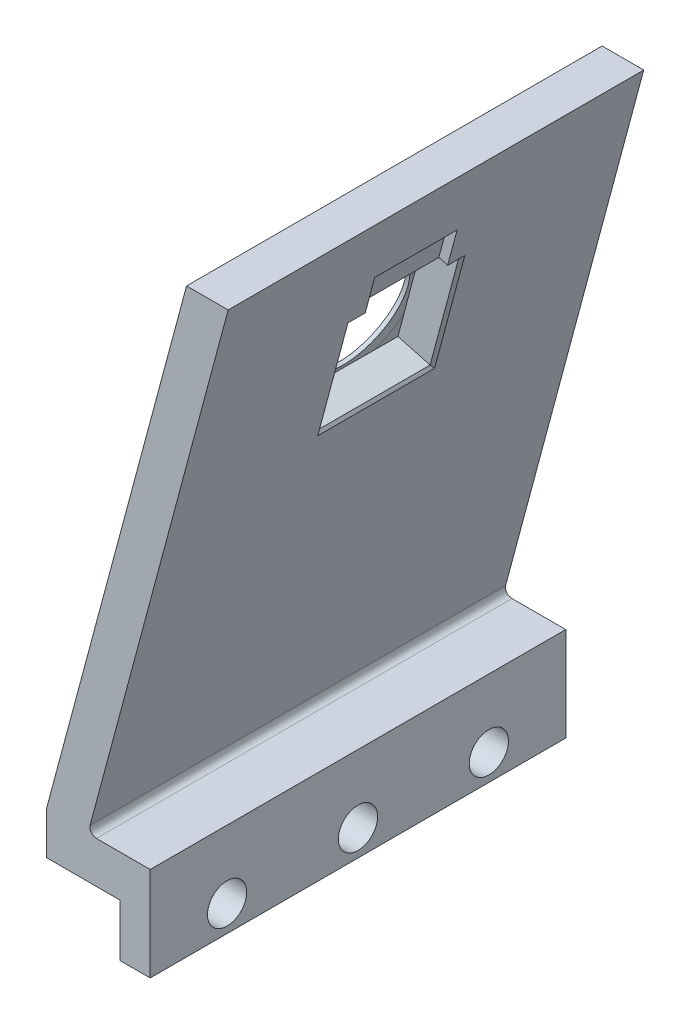
ISO-10303-21;
HEADER;
FILE_DESCRIPTION(('STEP AP214'),'2;1');
FILE_NAME('part.step','',(''),(''),'','','');
FILE_SCHEMA(('AUTOMOTIVE_DESIGN { 1 0 10303 214 1 1 1 1 }'));
ENDSEC;
DATA;
#1=APPLICATION_CONTEXT('core data for automotive mechanical design processes');
#2=APPLICATION_PROTOCOL_DEFINITION('international standard','automotive_design',2000,#1);
#3=PRODUCT_CONTEXT('',#1,'mechanical');
#4=PRODUCT('Part','Part','',(#3));
#5=PRODUCT_RELATED_PRODUCT_CATEGORY('part','',(#4));
#6=PRODUCT_DEFINITION_FORMATION('','',#4);
#7=PRODUCT_DEFINITION_CONTEXT('part definition',#1,'design');
#8=PRODUCT_DEFINITION('design','',#6,#7);
#9=PRODUCT_DEFINITION_SHAPE('','',#8);
#10=(LENGTH_UNIT() NAMED_UNIT(*) SI_UNIT(.MILLI.,.METRE.));
#11=(NAMED_UNIT(*) PLANE_ANGLE_UNIT() SI_UNIT($,.RADIAN.));
#12=(NAMED_UNIT(*) SI_UNIT($,.STERADIAN.) SOLID_ANGLE_UNIT());
#13=UNCERTAINTY_MEASURE_WITH_UNIT(LENGTH_MEASURE(1.E-05),#10,'distance_accuracy_value','');
#14=(GEOMETRIC_REPRESENTATION_CONTEXT(3) GLOBAL_UNCERTAINTY_ASSIGNED_CONTEXT((#13)) GLOBAL_UNIT_ASSIGNED_CONTEXT((#10,
#11,#12)) REPRESENTATION_CONTEXT('',''));
#15=CARTESIAN_POINT('',(0.,0.,0.));
#16=DIRECTION('',(0.,0.,1.));
#17=DIRECTION('',(1.,0.,0.));
#18=AXIS2_PLACEMENT_3D('',#15,#16,#17);
#19=CARTESIAN_POINT('',(0.310684369722334,-0.0832476259680732,0.));
#20=DIRECTION('',(0.965925826289067,-0.258819045102524,0.));
#21=DIRECTION('',(0.258819045102524,0.965925826289067,0.));
#22=AXIS2_PLACEMENT_3D('',#19,#20,#21);
#23=PLANE('',#22);
#24=DIRECTION('',(0.258819045102524,0.965925826289067,0.));
#25=VECTOR('',#24,1.);
#26=CARTESIAN_POINT('',(9.20190655999273,33.0992453295044,11.88));
#27=LINE('',#26,#25);
#28=CARTESIAN_POINT('',(6.99418010526819,24.8598980312586,11.88));
#29=VERTEX_POINT('',#28);
#30=CARTESIAN_POINT('',(7.46511628429863,26.6174557785225,11.88));
#31=VERTEX_POINT('',#30);
#32=EDGE_CURVE('E306',#29,#31,#27,.T.);
#33=ORIENTED_EDGE('',*,*,#32,.T.);
#34=CARTESIAN_POINT('',(8.08949677956881,28.9476755101258,16.145));
#35=DIRECTION('',(0.965925826289067,-0.258819045102524,0.));
#36=DIRECTION('',(0.258819045102524,0.965925826289067,0.));
#37=AXIS2_PLACEMENT_3D('',#34,#35,#36);
#38=CIRCLE('',#37,4.90000000004359);
#39=CARTESIAN_POINT('',(6.9941801052682,24.8598980312586,13.6751099889485));
#40=VERTEX_POINT('',#39);
#41=EDGE_CURVE('E438',#31,#40,#38,.F.);
#42=ORIENTED_EDGE('',*,*,#41,.T.);
#43=DIRECTION('',(0.,0.,-1.));
#44=VECTOR('',#43,1.);
#45=CARTESIAN_POINT('',(6.99418010526819,24.8598980312586,20.41));
#46=LINE('',#45,#44);
#47=EDGE_CURVE('E299',#40,#29,#46,.T.);
#48=ORIENTED_EDGE('',*,*,#47,.T.);
#49=EDGE_LOOP('',(#33,#42,#48));
#50=FACE_BOUND('',#49,.T.);
#51=ADVANCED_FACE('F80',(#50),#23,.T.);
#52=CARTESIAN_POINT('',(6.99418010526819,24.8598980312586,20.41));
#53=VERTEX_POINT('',#52);
#54=CARTESIAN_POINT('',(6.9941801052682,24.8598980312586,18.6148900110515));
#55=VERTEX_POINT('',#54);
#56=EDGE_CURVE('E301',#53,#55,#46,.T.);
#57=ORIENTED_EDGE('',*,*,#56,.T.);
#58=CARTESIAN_POINT('',(8.08949677956881,28.9476755101258,16.145));
#59=DIRECTION('',(0.965925826289067,-0.258819045102524,0.));
#60=DIRECTION('',(0.258819045102524,0.965925826289067,0.));
#61=AXIS2_PLACEMENT_3D('',#58,#59,#60);
#62=CIRCLE('',#61,4.90000000004359);
#63=CARTESIAN_POINT('',(7.46511628429863,26.6174557785225,20.41));
#64=VERTEX_POINT('',#63);
#65=EDGE_CURVE('E435',#55,#64,#62,.F.);
#66=ORIENTED_EDGE('',*,*,#65,.T.);
#67=DIRECTION('',(-0.258819045102524,-0.965925826289067,0.));
#68=VECTOR('',#67,1.);
#69=CARTESIAN_POINT('',(9.20190655999273,33.0992453295044,20.41));
#70=LINE('',#69,#68);
#71=EDGE_CURVE('E300',#64,#53,#70,.T.);
#72=ORIENTED_EDGE('',*,*,#71,.T.);
#73=EDGE_LOOP('',(#57,#66,#72));
#74=FACE_BOUND('',#73,.T.);
#75=ADVANCED_FACE('F512',(#74),#23,.T.);
#76=CARTESIAN_POINT('',(9.20190655999273,33.0992453295044,20.41));
#77=VERTEX_POINT('',#76);
#78=CARTESIAN_POINT('',(8.713877274839,31.2778952417292,20.41));
#79=VERTEX_POINT('',#78);
#80=EDGE_CURVE('E295',#77,#79,#70,.T.);
#81=ORIENTED_EDGE('',*,*,#80,.T.);
#82=CARTESIAN_POINT('',(8.08949677956881,28.9476755101258,16.145));
#83=DIRECTION('',(0.965925826289067,-0.258819045102524,0.));
#84=DIRECTION('',(0.258819045102524,0.965925826289067,0.));
#85=AXIS2_PLACEMENT_3D('',#82,#83,#84);
#86=CIRCLE('',#85,4.90000000004359);
#87=CARTESIAN_POINT('',(9.20190655999273,33.0992453295044,18.498085743374));
#88=VERTEX_POINT('',#87);
#89=EDGE_CURVE('E432',#79,#88,#86,.F.);
#90=ORIENTED_EDGE('',*,*,#89,.T.);
#91=DIRECTION('',(0.,0.,1.));
#92=VECTOR('',#91,1.);
#93=CARTESIAN_POINT('',(9.20190655999273,33.0992453295044,20.41));
#94=LINE('',#93,#92);
#95=EDGE_CURVE('E310',#88,#77,#94,.T.);
#96=ORIENTED_EDGE('',*,*,#95,.T.);
#97=EDGE_LOOP('',(#81,#90,#96));
#98=FACE_BOUND('',#97,.T.);
#99=ADVANCED_FACE('F517',(#98),#23,.T.);
#100=CARTESIAN_POINT('',(0.,-3.18,31.75));
#101=DIRECTION('',(0.,1.,0.));
#102=DIRECTION('',(-1.,0.,0.));
#103=AXIS2_PLACEMENT_3D('',#100,#101,#102);
#104=PLANE('',#103);
#105=DIRECTION('',(0.,0.,-1.));
#106=VECTOR('',#105,1.);
#107=CARTESIAN_POINT('',(5.64337203172193,-3.18,31.75));
#108=LINE('',#107,#106);
#109=CARTESIAN_POINT('',(5.64337203172193,-3.18,31.75));
#110=VERTEX_POINT('',#109);
#111=CARTESIAN_POINT('',(5.64337203172193,-3.18,0.));
#112=VERTEX_POINT('',#111);
#113=EDGE_CURVE('E399',#110,#112,#108,.T.);
#114=ORIENTED_EDGE('',*,*,#113,.F.);
#115=DIRECTION('',(1.,0.,0.));
#116=VECTOR('',#115,1.);
#117=CARTESIAN_POINT('',(0.,-3.18,31.75));
#118=LINE('',#117,#116);
#119=CARTESIAN_POINT('',(0.,-3.18,31.75));
#120=VERTEX_POINT('',#119);
#121=EDGE_CURVE('E340',#120,#110,#118,.T.);
#122=ORIENTED_EDGE('',*,*,#121,.F.);
#123=DIRECTION('',(0.,0.,-1.));
#124=VECTOR('',#123,1.);
#125=CARTESIAN_POINT('',(0.,-3.18,31.75));
#126=LINE('',#125,#124);
#127=CARTESIAN_POINT('',(0.,-3.18,0.));
#128=VERTEX_POINT('',#127);
#129=EDGE_CURVE('E392',#120,#128,#126,.T.);
#130=ORIENTED_EDGE('',*,*,#129,.T.);
#131=DIRECTION('',(1.,0.,0.));
#132=VECTOR('',#131,1.);
#133=CARTESIAN_POINT('',(0.,-3.18,0.));
#134=LINE('',#133,#132);
#135=EDGE_CURVE('E367',#128,#112,#134,.T.);
#136=ORIENTED_EDGE('',*,*,#135,.T.);
#137=EDGE_LOOP('',(#114,#122,#130,#136));
#138=FACE_BOUND('',#137,.T.);
#139=ADVANCED_FACE('F526',(#138),#104,.F.);
#140=CARTESIAN_POINT('',(0.,0.,31.75));
#141=DIRECTION('',(-0.965925826289067,0.258819045102525,0.));
#142=DIRECTION('',(-0.258819045102525,-0.965925826289067,0.));
#143=AXIS2_PLACEMENT_3D('',#140,#141,#142);
#144=PLANE('',#143);
#145=CARTESIAN_POINT('',(7.77881240984649,29.0309231360939,16.145));
#146=DIRECTION('',(-0.965925826289067,0.258819045102525,0.));
#147=DIRECTION('',(-0.258819045102525,-0.965925826289067,0.));
#148=AXIS2_PLACEMENT_3D('',#145,#146,#147);
#149=CIRCLE('',#148,3.98);
#150=CARTESIAN_POINT('',(6.74871261033844,25.1865383474634,16.145));
#151=VERTEX_POINT('',#150);
#152=EDGE_CURVE('E293',#151,#151,#149,.T.);
#153=ORIENTED_EDGE('',*,*,#152,.F.);
#154=EDGE_LOOP('',(#153));
#155=FACE_BOUND('',#154,.T.);
#156=DIRECTION('',(0.258819045102525,0.965925826289067,0.));
#157=VECTOR('',#156,1.);
#158=CARTESIAN_POINT('',(0.,0.,0.));
#159=LINE('',#158,#157);
#160=CARTESIAN_POINT('',(0.,0.,0.));
#161=VERTEX_POINT('',#160);
#162=CARTESIAN_POINT('',(10.7179676972451,40.,0.));
#163=VERTEX_POINT('',#162);
#164=EDGE_CURVE('E359',#161,#163,#159,.T.);
#165=ORIENTED_EDGE('',*,*,#164,.F.);
#166=DIRECTION('',(0.,0.,-1.));
#167=VECTOR('',#166,1.);
#168=CARTESIAN_POINT('',(0.,0.,31.75));
#169=LINE('',#168,#167);
#170=CARTESIAN_POINT('',(0.,0.,31.75));
#171=VERTEX_POINT('',#170);
#172=EDGE_CURVE('E396',#171,#161,#169,.T.);
#173=ORIENTED_EDGE('',*,*,#172,.F.);
#174=DIRECTION('',(0.258819045102525,0.965925826289067,0.));
#175=VECTOR('',#174,1.);
#176=CARTESIAN_POINT('',(0.,0.,31.75));
#177=LINE('',#176,#175);
#178=CARTESIAN_POINT('',(10.7179676972451,40.,31.75));
#179=VERTEX_POINT('',#178);
#180=EDGE_CURVE('E332',#171,#179,#177,.T.);
#181=ORIENTED_EDGE('',*,*,#180,.T.);
#182=DIRECTION('',(0.,0.,-1.));
#183=VECTOR('',#182,1.);
#184=CARTESIAN_POINT('',(10.7179676972451,40.,31.75));
#185=LINE('',#184,#183);
#186=EDGE_CURVE('E358',#179,#163,#185,.T.);
#187=ORIENTED_EDGE('',*,*,#186,.T.);
#188=EDGE_LOOP('',(#165,#173,#181,#187));
#189=FACE_BOUND('',#188,.T.);
#190=ADVANCED_FACE('F532',(#155,#189),#144,.T.);
#191=CARTESIAN_POINT('',(0.,0.,31.75));
#192=DIRECTION('',(1.,0.,0.));
#193=DIRECTION('',(0.,1.,0.));
#194=AXIS2_PLACEMENT_3D('',#191,#192,#193);
#195=PLANE('',#194);
#196=DIRECTION('',(0.,-1.,0.));
#197=VECTOR('',#196,1.);
#198=CARTESIAN_POINT('',(0.,0.,0.));
#199=LINE('',#198,#197);
#200=EDGE_CURVE('E363',#161,#128,#199,.T.);
#201=ORIENTED_EDGE('',*,*,#200,.T.);
#202=ORIENTED_EDGE('',*,*,#129,.F.);
#203=DIRECTION('',(0.,-1.,0.));
#204=VECTOR('',#203,1.);
#205=CARTESIAN_POINT('',(0.,0.,31.75));
#206=LINE('',#205,#204);
#207=EDGE_CURVE('E336',#171,#120,#206,.T.);
#208=ORIENTED_EDGE('',*,*,#207,.F.);
#209=ORIENTED_EDGE('',*,*,#172,.T.);
#210=EDGE_LOOP('',(#201,#202,#208,#209));
#211=FACE_BOUND('',#210,.T.);
#212=ADVANCED_FACE('F549',(#211),#195,.F.);
#213=CARTESIAN_POINT('',(7.94,0.,31.75));
#214=DIRECTION('',(1.,0.,0.));
#215=DIRECTION('',(0.,0.,-1.));
#216=AXIS2_PLACEMENT_3D('',#213,#214,#215);
#217=PLANE('',#216);
#218=CARTESIAN_POINT('',(7.94,-5.18,25.875));
#219=DIRECTION('',(1.,0.,0.));
#220=DIRECTION('',(0.,1.,0.));
#221=AXIS2_PLACEMENT_3D('',#218,#219,#220);
#222=CIRCLE('',#221,1.5);
#223=CARTESIAN_POINT('',(7.94,-3.68,25.875));
#224=VERTEX_POINT('',#223);
#225=EDGE_CURVE('E626',#224,#224,#222,.T.);
#226=ORIENTED_EDGE('',*,*,#225,.F.);
#227=EDGE_LOOP('',(#226));
#228=FACE_BOUND('',#227,.T.);
#229=CARTESIAN_POINT('',(7.94,-5.18,15.875));
#230=DIRECTION('',(1.,0.,0.));
#231=DIRECTION('',(0.,1.,0.));
#232=AXIS2_PLACEMENT_3D('',#229,#230,#231);
#233=CIRCLE('',#232,1.5);
#234=CARTESIAN_POINT('',(7.94,-3.68,15.875));
#235=VERTEX_POINT('',#234);
#236=EDGE_CURVE('E1037',#235,#235,#233,.T.);
#237=ORIENTED_EDGE('',*,*,#236,.F.);
#238=EDGE_LOOP('',(#237));
#239=FACE_BOUND('',#238,.T.);
#240=CARTESIAN_POINT('',(7.94,-5.18,5.875));
#241=DIRECTION('',(1.,0.,0.));
#242=DIRECTION('',(0.,1.,0.));
#243=AXIS2_PLACEMENT_3D('',#240,#241,#242);
#244=CIRCLE('',#243,1.5);
#245=CARTESIAN_POINT('',(7.94,-3.68,5.875));
#246=VERTEX_POINT('',#245);
#247=EDGE_CURVE('E1041',#246,#246,#244,.T.);
#248=ORIENTED_EDGE('',*,*,#247,.F.);
#249=EDGE_LOOP('',(#248));
#250=FACE_BOUND('',#249,.T.);
#251=DIRECTION('',(0.,-1.,0.));
#252=VECTOR('',#251,1.);
#253=CARTESIAN_POINT('',(7.94,0.,0.));
#254=LINE('',#253,#252);
#255=CARTESIAN_POINT('',(7.94,0.,0.));
#256=VERTEX_POINT('',#255);
#257=CARTESIAN_POINT('',(7.94,-7.18,0.));
#258=VERTEX_POINT('',#257);
#259=EDGE_CURVE('E371',#256,#258,#254,.T.);
#260=ORIENTED_EDGE('',*,*,#259,.F.);
#261=DIRECTION('',(0.,0.,-1.));
#262=VECTOR('',#261,1.);
#263=CARTESIAN_POINT('',(7.94,0.,31.75));
#264=LINE('',#263,#262);
#265=CARTESIAN_POINT('',(7.94,0.,31.75));
#266=VERTEX_POINT('',#265);
#267=EDGE_CURVE('E388',#266,#256,#264,.T.);
#268=ORIENTED_EDGE('',*,*,#267,.F.);
#269=DIRECTION('',(0.,-1.,0.));
#270=VECTOR('',#269,1.);
#271=CARTESIAN_POINT('',(7.94,0.,31.75));
#272=LINE('',#271,#270);
#273=CARTESIAN_POINT('',(7.94,-7.18,31.75));
#274=VERTEX_POINT('',#273);
#275=EDGE_CURVE('E344',#266,#274,#272,.T.);
#276=ORIENTED_EDGE('',*,*,#275,.T.);
#277=DIRECTION('',(0.,0.,-1.));
#278=VECTOR('',#277,1.);
#279=CARTESIAN_POINT('',(7.94,-7.18,31.75));
#280=LINE('',#279,#278);
#281=EDGE_CURVE('E408',#274,#258,#280,.T.);
#282=ORIENTED_EDGE('',*,*,#281,.T.);
#283=EDGE_LOOP('',(#260,#268,#276,#282));
#284=FACE_BOUND('',#283,.T.);
#285=ADVANCED_FACE('F552',(#228,#239,#250,#284),#217,.T.);
#286=CARTESIAN_POINT('',(0.,0.,31.75));
#287=DIRECTION('',(0.,1.,0.));
#288=DIRECTION('',(0.,0.,1.));
#289=AXIS2_PLACEMENT_3D('',#286,#287,#288);
#290=PLANE('',#289);
#291=DIRECTION('',(1.,0.,0.));
#292=VECTOR('',#291,1.);
#293=CARTESIAN_POINT('',(0.,0.,0.));
#294=LINE('',#293,#292);
#295=CARTESIAN_POINT('',(3.83161268642061,0.,0.));
#296=VERTEX_POINT('',#295);
#297=EDGE_CURVE('E374',#296,#256,#294,.T.);
#298=ORIENTED_EDGE('',*,*,#297,.F.);
#299=DIRECTION('',(0.,0.,-1.));
#300=VECTOR('',#299,1.);
#301=CARTESIAN_POINT('',(3.83161268642061,0.,31.75));
#302=LINE('',#301,#300);
#303=CARTESIAN_POINT('',(3.83161268642061,0.,31.75));
#304=VERTEX_POINT('',#303);
#305=EDGE_CURVE('E96',#296,#304,#302,.F.);
#306=ORIENTED_EDGE('',*,*,#305,.T.);
#307=DIRECTION('',(1.,0.,0.));
#308=VECTOR('',#307,1.);
#309=CARTESIAN_POINT('',(0.,0.,31.75));
#310=LINE('',#309,#308);
#311=EDGE_CURVE('E347',#304,#266,#310,.T.);
#312=ORIENTED_EDGE('',*,*,#311,.T.);
#313=ORIENTED_EDGE('',*,*,#267,.T.);
#314=EDGE_LOOP('',(#298,#306,#312,#313));
#315=FACE_BOUND('',#314,.T.);
#316=ADVANCED_FACE('F557',(#315),#290,.T.);
#317=CARTESIAN_POINT('',(2.96698039201726,-0.795000000000013,31.75));
#318=DIRECTION('',(0.965925826289067,-0.258819045102524,0.));
#319=DIRECTION('',(0.258819045102524,0.965925826289067,0.));
#320=AXIS2_PLACEMENT_3D('',#317,#318,#319);
#321=PLANE('',#320);
#322=DIRECTION('',(0.258819045102525,0.965925826289067,0.));
#323=VECTOR('',#322,1.);
#324=CARTESIAN_POINT('',(12.6346597175952,35.2852704343396,12.99));
#325=LINE('',#324,#323);
#326=CARTESIAN_POINT('',(11.9099663913082,32.5806781207302,12.99));
#327=VERTEX_POINT('',#326);
#328=CARTESIAN_POINT('',(12.6346597175952,35.2852704343396,12.99));
#329=VERTEX_POINT('',#328);
#330=EDGE_CURVE('E269',#327,#329,#325,.T.);
#331=ORIENTED_EDGE('',*,*,#330,.F.);
#332=DIRECTION('',(0.,0.,-1.));
#333=VECTOR('',#332,1.);
#334=CARTESIAN_POINT('',(11.9099663913082,32.5806781207302,11.88));
#335=LINE('',#334,#333);
#336=CARTESIAN_POINT('',(11.9099663913082,32.5806781207302,11.68));
#337=VERTEX_POINT('',#336);
#338=EDGE_CURVE('E681',#327,#337,#335,.T.);
#339=ORIENTED_EDGE('',*,*,#338,.T.);
#340=DIRECTION('',(-0.258819045102524,-0.965925826289067,0.));
#341=VECTOR('',#340,1.);
#342=CARTESIAN_POINT('',(9.65047612756312,24.1481456572267,11.68));
#343=LINE('',#342,#341);
#344=CARTESIAN_POINT('',(9.59871231854262,23.9549604919689,11.68));
#345=VERTEX_POINT('',#344);
#346=EDGE_CURVE('E684',#337,#345,#343,.T.);
#347=ORIENTED_EDGE('',*,*,#346,.T.);
#348=DIRECTION('',(0.,0.,1.));
#349=VECTOR('',#348,1.);
#350=CARTESIAN_POINT('',(9.59871231854262,23.9549604919689,20.41));
#351=LINE('',#350,#349);
#352=CARTESIAN_POINT('',(9.59871231854262,23.9549604919689,20.61));
#353=VERTEX_POINT('',#352);
#354=EDGE_CURVE('E687',#345,#353,#351,.T.);
#355=ORIENTED_EDGE('',*,*,#354,.T.);
#356=DIRECTION('',(0.258819045102524,0.965925826289067,0.));
#357=VECTOR('',#356,1.);
#358=CARTESIAN_POINT('',(11.8582025822877,32.3874929554724,20.61));
#359=LINE('',#358,#357);
#360=CARTESIAN_POINT('',(11.9099663913082,32.5806781207302,20.61));
#361=VERTEX_POINT('',#360);
#362=EDGE_CURVE('E690',#353,#361,#359,.T.);
#363=ORIENTED_EDGE('',*,*,#362,.T.);
#364=DIRECTION('',(0.,0.,-1.));
#365=VECTOR('',#364,1.);
#366=CARTESIAN_POINT('',(11.9099663913082,32.5806781207302,19.29));
#367=LINE('',#366,#365);
#368=CARTESIAN_POINT('',(11.9099663913082,32.5806781207302,19.29));
#369=VERTEX_POINT('',#368);
#370=EDGE_CURVE('E694',#361,#369,#367,.T.);
#371=ORIENTED_EDGE('',*,*,#370,.T.);
#372=DIRECTION('',(-0.258819045102525,-0.965925826289067,0.));
#373=VECTOR('',#372,1.);
#374=CARTESIAN_POINT('',(12.6346597175952,35.2852704343396,19.29));
#375=LINE('',#374,#373);
#376=CARTESIAN_POINT('',(12.6346597175952,35.2852704343396,19.29));
#377=VERTEX_POINT('',#376);
#378=EDGE_CURVE('E282',#377,#369,#375,.T.);
#379=ORIENTED_EDGE('',*,*,#378,.F.);
#380=DIRECTION('',(0.,0.,1.));
#381=VECTOR('',#380,1.);
#382=CARTESIAN_POINT('',(12.6346597175952,35.2852704343396,19.29));
#383=LINE('',#382,#381);
#384=EDGE_CURVE('E289',#329,#377,#383,.T.);
#385=ORIENTED_EDGE('',*,*,#384,.F.);
#386=EDGE_LOOP('',(#331,#339,#347,#355,#363,#371,#379,#385));
#387=FACE_BOUND('',#386,.T.);
#388=DIRECTION('',(-0.258819045102524,-0.965925826289067,0.));
#389=VECTOR('',#388,1.);
#390=CARTESIAN_POINT('',(2.96698039201726,-0.795000000000013,31.75));
#391=LINE('',#390,#389);
#392=CARTESIAN_POINT('',(13.8979676972451,40.,31.75));
#393=VERTEX_POINT('',#392);
#394=CARTESIAN_POINT('',(3.34864977327608,0.629409522551262,31.75));
#395=VERTEX_POINT('',#394);
#396=EDGE_CURVE('E350',#393,#395,#391,.T.);
#397=ORIENTED_EDGE('',*,*,#396,.T.);
#398=DIRECTION('',(0.,0.,-1.));
#399=VECTOR('',#398,1.);
#400=CARTESIAN_POINT('',(3.34864977327608,0.629409522551262,0.));
#401=LINE('',#400,#399);
#402=CARTESIAN_POINT('',(3.34864977327608,0.629409522551262,0.));
#403=VERTEX_POINT('',#402);
#404=EDGE_CURVE('E602',#395,#403,#401,.T.);
#405=ORIENTED_EDGE('',*,*,#404,.T.);
#406=DIRECTION('',(-0.258819045102524,-0.965925826289067,0.));
#407=VECTOR('',#406,1.);
#408=CARTESIAN_POINT('',(2.96698039201726,-0.795000000000013,0.));
#409=LINE('',#408,#407);
#410=CARTESIAN_POINT('',(13.8979676972451,40.,0.));
#411=VERTEX_POINT('',#410);
#412=EDGE_CURVE('E377',#411,#403,#409,.T.);
#413=ORIENTED_EDGE('',*,*,#412,.F.);
#414=DIRECTION('',(0.,0.,-1.));
#415=VECTOR('',#414,1.);
#416=CARTESIAN_POINT('',(13.8979676972451,40.,31.75));
#417=LINE('',#416,#415);
#418=EDGE_CURVE('E385',#393,#411,#417,.T.);
#419=ORIENTED_EDGE('',*,*,#418,.F.);
#420=EDGE_LOOP('',(#397,#405,#413,#419));
#421=FACE_BOUND('',#420,.T.);
#422=ADVANCED_FACE('F561',(#387,#421),#321,.T.);
#423=CARTESIAN_POINT('',(0.,40.,31.75));
#424=DIRECTION('',(0.,1.,0.));
#425=DIRECTION('',(0.,0.,1.));
#426=AXIS2_PLACEMENT_3D('',#423,#424,#425);
#427=PLANE('',#426);
#428=DIRECTION('',(1.,0.,0.));
#429=VECTOR('',#428,1.);
#430=CARTESIAN_POINT('',(0.,40.,0.));
#431=LINE('',#430,#429);
#432=EDGE_CURVE('E337',#163,#411,#431,.T.);
#433=ORIENTED_EDGE('',*,*,#432,.F.);
#434=ORIENTED_EDGE('',*,*,#186,.F.);
#435=DIRECTION('',(1.,0.,0.));
#436=VECTOR('',#435,1.);
#437=CARTESIAN_POINT('',(0.,40.,31.75));
#438=LINE('',#437,#436);
#439=EDGE_CURVE('E354',#179,#393,#438,.T.);
#440=ORIENTED_EDGE('',*,*,#439,.T.);
#441=ORIENTED_EDGE('',*,*,#418,.T.);
#442=EDGE_LOOP('',(#433,#434,#440,#441));
#443=FACE_BOUND('',#442,.T.);
#444=ADVANCED_FACE('F564',(#443),#427,.T.);
#445=CARTESIAN_POINT('',(0.,0.,31.75));
#446=DIRECTION('',(0.,0.,1.));
#447=DIRECTION('',(1.,0.,0.));
#448=AXIS2_PLACEMENT_3D('',#445,#446,#447);
#449=PLANE('',#448);
#450=ORIENTED_EDGE('',*,*,#180,.F.);
#451=ORIENTED_EDGE('',*,*,#207,.T.);
#452=ORIENTED_EDGE('',*,*,#121,.T.);
#453=DIRECTION('',(0.,-1.,0.));
#454=VECTOR('',#453,1.);
#455=CARTESIAN_POINT('',(5.64337203172193,-3.18,31.75));
#456=LINE('',#455,#454);
#457=CARTESIAN_POINT('',(5.64337203172194,-7.18,31.75));
#458=VERTEX_POINT('',#457);
#459=EDGE_CURVE('E404',#110,#458,#456,.T.);
#460=ORIENTED_EDGE('',*,*,#459,.T.);
#461=DIRECTION('',(1.,0.,0.));
#462=VECTOR('',#461,1.);
#463=CARTESIAN_POINT('',(5.64337203172194,-7.18,31.75));
#464=LINE('',#463,#462);
#465=EDGE_CURVE('E400',#458,#274,#464,.T.);
#466=ORIENTED_EDGE('',*,*,#465,.T.);
#467=ORIENTED_EDGE('',*,*,#275,.F.);
#468=ORIENTED_EDGE('',*,*,#311,.F.);
#469=CARTESIAN_POINT('',(3.83161268642061,0.5,31.75));
#470=DIRECTION('',(0.,0.,1.));
#471=DIRECTION('',(1.,0.,0.));
#472=AXIS2_PLACEMENT_3D('',#469,#470,#471);
#473=CIRCLE('',#472,0.5);
#474=EDGE_CURVE('E13',#304,#395,#473,.F.);
#475=ORIENTED_EDGE('',*,*,#474,.T.);
#476=ORIENTED_EDGE('',*,*,#396,.F.);
#477=ORIENTED_EDGE('',*,*,#439,.F.);
#478=EDGE_LOOP('',(#450,#451,#452,#460,#466,#467,#468,#475,#476,#477));
#479=FACE_BOUND('',#478,.T.);
#480=ADVANCED_FACE('F568',(#479),#449,.T.);
#481=CARTESIAN_POINT('',(0.,0.,0.));
#482=DIRECTION('',(0.,0.,1.));
#483=DIRECTION('',(1.,0.,0.));
#484=AXIS2_PLACEMENT_3D('',#481,#482,#483);
#485=PLANE('',#484);
#486=ORIENTED_EDGE('',*,*,#164,.T.);
#487=ORIENTED_EDGE('',*,*,#432,.T.);
#488=ORIENTED_EDGE('',*,*,#412,.T.);
#489=CARTESIAN_POINT('',(3.83161268642061,0.5,0.));
#490=DIRECTION('',(0.,0.,1.));
#491=DIRECTION('',(1.,0.,0.));
#492=AXIS2_PLACEMENT_3D('',#489,#490,#491);
#493=CIRCLE('',#492,0.5);
#494=EDGE_CURVE('E89',#403,#296,#493,.T.);
#495=ORIENTED_EDGE('',*,*,#494,.T.);
#496=ORIENTED_EDGE('',*,*,#297,.T.);
#497=ORIENTED_EDGE('',*,*,#259,.T.);
#498=DIRECTION('',(1.,0.,0.));
#499=VECTOR('',#498,1.);
#500=CARTESIAN_POINT('',(5.64337203172194,-7.18,0.));
#501=LINE('',#500,#499);
#502=CARTESIAN_POINT('',(5.64337203172194,-7.18,0.));
#503=VERTEX_POINT('',#502);
#504=EDGE_CURVE('E320',#503,#258,#501,.T.);
#505=ORIENTED_EDGE('',*,*,#504,.F.);
#506=DIRECTION('',(0.,-1.,0.));
#507=VECTOR('',#506,1.);
#508=CARTESIAN_POINT('',(5.64337203172193,-3.18,0.));
#509=LINE('',#508,#507);
#510=EDGE_CURVE('E405',#112,#503,#509,.T.);
#511=ORIENTED_EDGE('',*,*,#510,.F.);
#512=ORIENTED_EDGE('',*,*,#135,.F.);
#513=ORIENTED_EDGE('',*,*,#200,.F.);
#514=EDGE_LOOP('',(#486,#487,#488,#495,#496,#497,#505,#511,#512,#513));
#515=FACE_BOUND('',#514,.T.);
#516=ADVANCED_FACE('F542',(#515),#485,.F.);
#517=CARTESIAN_POINT('',(5.64337203172194,-7.18,31.75));
#518=DIRECTION('',(0.,1.,0.));
#519=DIRECTION('',(0.,0.,1.));
#520=AXIS2_PLACEMENT_3D('',#517,#518,#519);
#521=PLANE('',#520);
#522=ORIENTED_EDGE('',*,*,#504,.T.);
#523=ORIENTED_EDGE('',*,*,#281,.F.);
#524=ORIENTED_EDGE('',*,*,#465,.F.);
#525=DIRECTION('',(0.,0.,-1.));
#526=VECTOR('',#525,1.);
#527=CARTESIAN_POINT('',(5.64337203172194,-7.18,31.75));
#528=LINE('',#527,#526);
#529=EDGE_CURVE('E364',#458,#503,#528,.T.);
#530=ORIENTED_EDGE('',*,*,#529,.T.);
#531=EDGE_LOOP('',(#522,#523,#524,#530));
#532=FACE_BOUND('',#531,.T.);
#533=ADVANCED_FACE('F473',(#532),#521,.F.);
#534=CARTESIAN_POINT('',(5.64337203172193,-3.18,31.75));
#535=DIRECTION('',(1.,0.,0.));
#536=DIRECTION('',(0.,1.,0.));
#537=AXIS2_PLACEMENT_3D('',#534,#535,#536);
#538=PLANE('',#537);
#539=CARTESIAN_POINT('',(5.64337203172194,-5.18,25.875));
#540=DIRECTION('',(1.,0.,0.));
#541=DIRECTION('',(0.,1.,0.));
#542=AXIS2_PLACEMENT_3D('',#539,#540,#541);
#543=CIRCLE('',#542,1.5);
#544=CARTESIAN_POINT('',(5.64337203172193,-3.68,25.875));
#545=VERTEX_POINT('',#544);
#546=EDGE_CURVE('E613',#545,#545,#543,.T.);
#547=ORIENTED_EDGE('',*,*,#546,.T.);
#548=EDGE_LOOP('',(#547));
#549=FACE_BOUND('',#548,.T.);
#550=CARTESIAN_POINT('',(5.64337203172194,-5.18,15.875));
#551=DIRECTION('',(1.,0.,0.));
#552=DIRECTION('',(0.,1.,0.));
#553=AXIS2_PLACEMENT_3D('',#550,#551,#552);
#554=CIRCLE('',#553,1.5);
#555=CARTESIAN_POINT('',(5.64337203172193,-3.68,15.875));
#556=VERTEX_POINT('',#555);
#557=EDGE_CURVE('E618',#556,#556,#554,.T.);
#558=ORIENTED_EDGE('',*,*,#557,.T.);
#559=EDGE_LOOP('',(#558));
#560=FACE_BOUND('',#559,.T.);
#561=CARTESIAN_POINT('',(5.64337203172194,-5.18,5.875));
#562=DIRECTION('',(1.,0.,0.));
#563=DIRECTION('',(0.,1.,0.));
#564=AXIS2_PLACEMENT_3D('',#561,#562,#563);
#565=CIRCLE('',#564,1.5);
#566=CARTESIAN_POINT('',(5.64337203172193,-3.68,5.875));
#567=VERTEX_POINT('',#566);
#568=EDGE_CURVE('E622',#567,#567,#565,.T.);
#569=ORIENTED_EDGE('',*,*,#568,.T.);
#570=EDGE_LOOP('',(#569));
#571=FACE_BOUND('',#570,.T.);
#572=ORIENTED_EDGE('',*,*,#510,.T.);
#573=ORIENTED_EDGE('',*,*,#529,.F.);
#574=ORIENTED_EDGE('',*,*,#459,.F.);
#575=ORIENTED_EDGE('',*,*,#113,.T.);
#576=EDGE_LOOP('',(#572,#573,#574,#575));
#577=FACE_BOUND('',#576,.T.);
#578=ADVANCED_FACE('F528',(#549,#560,#571,#577),#538,.F.);
#579=CARTESIAN_POINT('',(9.20190655999273,33.0992453295044,20.41));
#580=DIRECTION('',(0.,0.,1.));
#581=DIRECTION('',(0.,-1.,0.));
#582=AXIS2_PLACEMENT_3D('',#579,#580,#581);
#583=PLANE('',#582);
#584=DIRECTION('',(0.965925826289067,-0.258819045102524,0.));
#585=VECTOR('',#584,1.);
#586=CARTESIAN_POINT('',(9.20190655999273,33.0992453295044,20.41));
#587=LINE('',#586,#585);
#588=CARTESIAN_POINT('',(11.6650174170298,32.4392567644929,20.41));
#589=VERTEX_POINT('',#588);
#590=EDGE_CURVE('E316',#77,#589,#587,.T.);
#591=ORIENTED_EDGE('',*,*,#590,.T.);
#592=DIRECTION('',(-0.258819045102524,-0.965925826289067,0.));
#593=VECTOR('',#592,1.);
#594=CARTESIAN_POINT('',(9.45729096230531,24.1999094662472,20.41));
#595=LINE('',#594,#593);
#596=CARTESIAN_POINT('',(9.45729096230531,24.1999094662472,20.41));
#597=VERTEX_POINT('',#596);
#598=EDGE_CURVE('E696',#589,#597,#595,.T.);
#599=ORIENTED_EDGE('',*,*,#598,.T.);
#600=DIRECTION('',(0.965925826289067,-0.258819045102524,0.));
#601=VECTOR('',#600,1.);
#602=CARTESIAN_POINT('',(6.99418010526819,24.8598980312586,20.41));
#603=LINE('',#602,#601);
#604=EDGE_CURVE('E315',#53,#597,#603,.T.);
#605=ORIENTED_EDGE('',*,*,#604,.F.);
#606=ORIENTED_EDGE('',*,*,#71,.F.);
#607=CARTESIAN_POINT('',(7.46511628429863,26.6174557785225,20.41));
#608=CARTESIAN_POINT('',(7.5658012203769,27.0067243102746,20.41));
#609=CARTESIAN_POINT('',(7.6671884505561,27.3958129773719,20.41));
#610=CARTESIAN_POINT('',(7.87165125279305,28.1735374332685,20.41));
#611=CARTESIAN_POINT('',(7.97472678910124,28.5621732314711,20.41));
#612=CARTESIAN_POINT('',(8.18285419155898,29.3389152718915,20.41));
#613=CARTESIAN_POINT('',(8.28790605770853,29.7270215141091,20.41));
#614=CARTESIAN_POINT('',(8.49969830479069,30.5027820511785,20.41));
#615=CARTESIAN_POINT('',(8.60643872138496,30.8904363362989,20.41));
#616=CARTESIAN_POINT('',(8.71387727483937,31.2778952417291,20.41));
#617=B_SPLINE_CURVE_WITH_KNOTS('',3,(#607,#608,#609,#610,#611,#612,#613,#614,#615,#616),
.UNSPECIFIED.,.F.,.F.,(4,2,2,2,4),(0.,1.2062388271041,2.41245214526529,3.61866546342648,
4.82490429053059),.UNSPECIFIED.);
#618=EDGE_CURVE('E451',#64,#79,#617,.T.);
#619=ORIENTED_EDGE('',*,*,#618,.T.);
#620=ORIENTED_EDGE('',*,*,#80,.F.);
#621=EDGE_LOOP('',(#591,#599,#605,#606,#619,#620));
#622=FACE_BOUND('',#621,.T.);
#623=ADVANCED_FACE('F500',(#622),#583,.F.);
#624=CARTESIAN_POINT('',(9.20190655999273,33.0992453295044,20.41));
#625=DIRECTION('',(0.258819045102524,0.965925826289067,0.));
#626=DIRECTION('',(-0.965925826289067,0.258819045102524,0.));
#627=AXIS2_PLACEMENT_3D('',#624,#625,#626);
#628=PLANE('',#627);
#629=DIRECTION('',(0.965925826289067,-0.258819045102524,0.));
#630=VECTOR('',#629,1.);
#631=CARTESIAN_POINT('',(9.20190655999273,33.0992453295044,11.88));
#632=LINE('',#631,#630);
#633=CARTESIAN_POINT('',(9.20190655999273,33.0992453295044,11.88));
#634=VERTEX_POINT('',#633);
#635=CARTESIAN_POINT('',(11.6650174170298,32.4392567644929,11.88));
#636=VERTEX_POINT('',#635);
#637=EDGE_CURVE('E321',#634,#636,#632,.T.);
#638=ORIENTED_EDGE('',*,*,#637,.T.);
#639=DIRECTION('',(0.,0.,1.));
#640=VECTOR('',#639,1.);
#641=CARTESIAN_POINT('',(11.6650174170298,32.4392567644929,12.99));
#642=LINE('',#641,#640);
#643=CARTESIAN_POINT('',(11.6650174170298,32.4392567644929,12.79));
#644=VERTEX_POINT('',#643);
#645=EDGE_CURVE('E660',#636,#644,#642,.T.);
#646=ORIENTED_EDGE('',*,*,#645,.T.);
#647=DIRECTION('',(-0.965925826289067,0.258819045102524,0.));
#648=VECTOR('',#647,1.);
#649=CARTESIAN_POINT('',(9.20190655999273,33.0992453295044,12.79));
#650=LINE('',#649,#648);
#651=CARTESIAN_POINT('',(10.9888693386275,32.6204300960647,12.79));
#652=VERTEX_POINT('',#651);
#653=EDGE_CURVE('E663',#644,#652,#650,.T.);
#654=ORIENTED_EDGE('',*,*,#653,.T.);
#655=DIRECTION('',(0.,0.,1.));
#656=VECTOR('',#655,1.);
#657=CARTESIAN_POINT('',(10.9888693386275,32.6204300960647,19.29));
#658=LINE('',#657,#656);
#659=CARTESIAN_POINT('',(10.9888693386275,32.6204300960647,19.49));
#660=VERTEX_POINT('',#659);
#661=EDGE_CURVE('E666',#652,#660,#658,.T.);
#662=ORIENTED_EDGE('',*,*,#661,.T.);
#663=DIRECTION('',(0.965925826289067,-0.258819045102524,0.));
#664=VECTOR('',#663,1.);
#665=CARTESIAN_POINT('',(9.20190655999273,33.0992453295044,19.49));
#666=LINE('',#665,#664);
#667=CARTESIAN_POINT('',(11.6650174170298,32.4392567644929,19.49));
#668=VERTEX_POINT('',#667);
#669=EDGE_CURVE('E669',#660,#668,#666,.T.);
#670=ORIENTED_EDGE('',*,*,#669,.T.);
#671=DIRECTION('',(0.,0.,1.));
#672=VECTOR('',#671,1.);
#673=CARTESIAN_POINT('',(11.6650174170298,32.4392567644929,20.41));
#674=LINE('',#673,#672);
#675=EDGE_CURVE('E672',#668,#589,#674,.T.);
#676=ORIENTED_EDGE('',*,*,#675,.T.);
#677=ORIENTED_EDGE('',*,*,#590,.F.);
#678=ORIENTED_EDGE('',*,*,#95,.F.);
#679=CARTESIAN_POINT('',(9.20190655999273,33.0992453295044,18.498085743374));
#680=CARTESIAN_POINT('',(9.19869494762981,33.1001058784434,18.105910767916));
#681=CARTESIAN_POINT('',(9.19615754414481,33.1007857736581,17.7137283687973));
#682=CARTESIAN_POINT('',(9.19268859660352,33.1017152753504,16.9293639796869));
#683=CARTESIAN_POINT('',(9.19175702047615,33.1019648904214,16.5371819898435));
#684=CARTESIAN_POINT('',(9.19175702047614,33.1019648904214,15.7528180101565));
#685=CARTESIAN_POINT('',(9.19268859660351,33.1017152753504,15.3606360203131));
#686=CARTESIAN_POINT('',(9.19615754414482,33.1007857736581,14.5762716312027));
#687=CARTESIAN_POINT('',(9.19869494762985,33.1001058784434,14.184089232084));
#688=CARTESIAN_POINT('',(9.20190655999282,33.0992453295043,13.791914256626));
#689=B_SPLINE_CURVE_WITH_KNOTS('',3,(#679,#680,#681,#682,#683,#684,#685,#686,#687,#688),
.UNSPECIFIED.,.F.,.F.,(4,2,2,2,4),(0.,1.17656899370472,2.35311448905615,3.52965998440759,
4.70622897811231),.UNSPECIFIED.);
#690=CARTESIAN_POINT('',(9.20190655999273,33.0992453295044,13.791914256626));
#691=VERTEX_POINT('',#690);
#692=EDGE_CURVE('E482',#88,#691,#689,.T.);
#693=ORIENTED_EDGE('',*,*,#692,.T.);
#694=EDGE_CURVE('E311',#634,#691,#94,.T.);
#695=ORIENTED_EDGE('',*,*,#694,.F.);
#696=EDGE_LOOP('',(#638,#646,#654,#662,#670,#676,#677,#678,#693,#695));
#697=FACE_BOUND('',#696,.T.);
#698=ADVANCED_FACE('F495',(#697),#628,.F.);
#699=CARTESIAN_POINT('',(9.20190655999273,33.0992453295044,11.88));
#700=DIRECTION('',(0.,0.,-1.));
#701=DIRECTION('',(0.,1.,0.));
#702=AXIS2_PLACEMENT_3D('',#699,#700,#701);
#703=PLANE('',#702);
#704=DIRECTION('',(0.965925826289067,-0.258819045102524,0.));
#705=VECTOR('',#704,1.);
#706=CARTESIAN_POINT('',(6.99418010526819,24.8598980312586,11.88));
#707=LINE('',#706,#705);
#708=CARTESIAN_POINT('',(9.45729096230531,24.1999094662472,11.88));
#709=VERTEX_POINT('',#708);
#710=EDGE_CURVE('E325',#29,#709,#707,.T.);
#711=ORIENTED_EDGE('',*,*,#710,.T.);
#712=DIRECTION('',(0.258819045102524,0.965925826289067,0.));
#713=VECTOR('',#712,1.);
#714=CARTESIAN_POINT('',(11.6650174170298,32.4392567644929,11.88));
#715=LINE('',#714,#713);
#716=EDGE_CURVE('E675',#709,#636,#715,.T.);
#717=ORIENTED_EDGE('',*,*,#716,.T.);
#718=ORIENTED_EDGE('',*,*,#637,.F.);
#719=CARTESIAN_POINT('',(8.713877274839,31.2778952417292,11.88));
#720=VERTEX_POINT('',#719);
#721=EDGE_CURVE('E305',#720,#634,#27,.T.);
#722=ORIENTED_EDGE('',*,*,#721,.F.);
#723=CARTESIAN_POINT('',(8.713877274839,31.2778952417292,11.88));
#724=CARTESIAN_POINT('',(8.60643872138479,30.8904363362989,11.88));
#725=CARTESIAN_POINT('',(8.49969830479064,30.5027820511785,11.88));
#726=CARTESIAN_POINT('',(8.28790605770858,29.7270215141091,11.88));
#727=CARTESIAN_POINT('',(8.18285419155901,29.3389152718914,11.88));
#728=CARTESIAN_POINT('',(7.97472678910119,28.5621732314711,11.88));
#729=CARTESIAN_POINT('',(7.87165125279293,28.1735374332685,11.88));
#730=CARTESIAN_POINT('',(7.66718845055621,27.3958129773718,11.88));
#731=CARTESIAN_POINT('',(7.5658012203773,27.0067243102745,11.88));
#732=CARTESIAN_POINT('',(7.46511628429973,26.6174557785222,11.88));
#733=B_SPLINE_CURVE_WITH_KNOTS('',3,(#723,#724,#725,#726,#727,#728,#729,#730,#731,#732),
.UNSPECIFIED.,.F.,.F.,(4,2,2,2,4),(0.,1.20623882710411,2.4124521452653,3.61866546342648,
4.8249042905306),.UNSPECIFIED.);
#734=EDGE_CURVE('E489',#720,#31,#733,.T.);
#735=ORIENTED_EDGE('',*,*,#734,.T.);
#736=ORIENTED_EDGE('',*,*,#32,.F.);
#737=EDGE_LOOP('',(#711,#717,#718,#722,#735,#736));
#738=FACE_BOUND('',#737,.T.);
#739=ADVANCED_FACE('F499',(#738),#703,.F.);
#740=CARTESIAN_POINT('',(6.99418010526819,24.8598980312586,20.41));
#741=DIRECTION('',(-0.258819045102524,-0.965925826289067,0.));
#742=DIRECTION('',(0.965925826289067,-0.258819045102524,0.));
#743=AXIS2_PLACEMENT_3D('',#740,#741,#742);
#744=PLANE('',#743);
#745=ORIENTED_EDGE('',*,*,#604,.T.);
#746=DIRECTION('',(0.,0.,-1.));
#747=VECTOR('',#746,1.);
#748=CARTESIAN_POINT('',(9.45729096230531,24.1999094662472,11.88));
#749=LINE('',#748,#747);
#750=EDGE_CURVE('E678',#597,#709,#749,.T.);
#751=ORIENTED_EDGE('',*,*,#750,.T.);
#752=ORIENTED_EDGE('',*,*,#710,.F.);
#753=ORIENTED_EDGE('',*,*,#47,.F.);
#754=CARTESIAN_POINT('',(6.9941801052682,24.8598980312586,13.6751099889485));
#755=CARTESIAN_POINT('',(6.99243157216904,24.8603665492905,13.880931241259));
#756=CARTESIAN_POINT('',(6.99084517255342,24.8607916237864,14.0867540105088));
#757=CARTESIAN_POINT('',(6.98806126147729,24.861537570511,14.4984026949053));
#758=CARTESIAN_POINT('',(6.98686375067596,24.8618584425632,14.7042286100567));
#759=CARTESIAN_POINT('',(6.98395153776764,24.8626387676601,15.3217004568048));
#760=CARTESIAN_POINT('',(6.98291706630732,24.8629159534525,15.7333502284024));
#761=CARTESIAN_POINT('',(6.98291706630737,24.8629159534525,16.5566497715976));
#762=CARTESIAN_POINT('',(6.98395153776774,24.8626387676601,16.9682995431952));
#763=CARTESIAN_POINT('',(6.9868637506759,24.8618584425632,17.5857713899433));
#764=CARTESIAN_POINT('',(6.98806126147715,24.861537570511,17.7915973050948));
#765=CARTESIAN_POINT('',(6.99084517255356,24.8607916237863,18.2032459894912));
#766=CARTESIAN_POINT('',(6.99243157216955,24.8603665492904,18.409068758741));
#767=CARTESIAN_POINT('',(6.99418010526957,24.8598980312583,18.6148900110516));
#768=B_SPLINE_CURVE_WITH_KNOTS('',3,(#754,#755,#756,#757,#758,#759,#760,#761,#762,#763,#764,
#765,#766,#767),.UNSPECIFIED.,.F.,.F.,(4,2,2,2,2,2,4),(0.,0.617487580822228,1.23497620831214,
2.46992424611049,3.70487228390884,4.32236091139876,4.93984849222098),.UNSPECIFIED.);
#769=EDGE_CURVE('E442',#40,#55,#768,.T.);
#770=ORIENTED_EDGE('',*,*,#769,.T.);
#771=ORIENTED_EDGE('',*,*,#56,.F.);
#772=EDGE_LOOP('',(#745,#751,#752,#753,#770,#771));
#773=FACE_BOUND('',#772,.T.);
#774=ADVANCED_FACE('F458',(#773),#744,.F.);
#775=ORIENTED_EDGE('',*,*,#694,.T.);
#776=CARTESIAN_POINT('',(8.08949677956881,28.9476755101258,16.145));
#777=DIRECTION('',(0.965925826289067,-0.258819045102524,0.));
#778=DIRECTION('',(0.258819045102524,0.965925826289067,0.));
#779=AXIS2_PLACEMENT_3D('',#776,#777,#778);
#780=CIRCLE('',#779,4.90000000004359);
#781=EDGE_CURVE('E429',#691,#720,#780,.F.);
#782=ORIENTED_EDGE('',*,*,#781,.T.);
#783=ORIENTED_EDGE('',*,*,#721,.T.);
#784=EDGE_LOOP('',(#775,#782,#783));
#785=FACE_BOUND('',#784,.T.);
#786=ADVANCED_FACE('F502',(#785),#23,.T.);
#787=CARTESIAN_POINT('',(-22.5786482051091,37.165180192131,16.145));
#788=DIRECTION('',(0.965925826289067,-0.258819045102525,0.));
#789=DIRECTION('',(0.258819045102525,0.965925826289067,0.));
#790=AXIS2_PLACEMENT_3D('',#787,#788,#789);
#791=CYLINDRICAL_SURFACE('',#790,3.98);
#792=CARTESIAN_POINT('',(8.07398530539619,28.9518317971038,16.145));
#793=DIRECTION('',(0.965925826289108,-0.258819045102374,0.));
#794=DIRECTION('',(0.258819045102374,0.965925826289108,0.));
#795=AXIS2_PLACEMENT_3D('',#792,#793,#794);
#796=CIRCLE('',#795,3.98);
#797=CARTESIAN_POINT('',(9.10408510490364,32.7962165857345,16.145));
#798=VERTEX_POINT('',#797);
#799=EDGE_CURVE('E416',#798,#798,#796,.T.);
#800=ORIENTED_EDGE('',*,*,#799,.T.);
#801=EDGE_LOOP('',(#800));
#802=FACE_BOUND('',#801,.T.);
#803=ORIENTED_EDGE('',*,*,#152,.T.);
#804=EDGE_LOOP('',(#803));
#805=FACE_BOUND('',#804,.T.);
#806=ADVANCED_FACE('F471',(#802,#805),#791,.F.);
#807=CARTESIAN_POINT('',(8.07398530539619,28.9518317971038,16.145));
#808=DIRECTION('',(0.965925826289108,-0.258819045102374,0.));
#809=DIRECTION('',(0.258819045102374,0.965925826289108,0.));
#810=AXIS2_PLACEMENT_3D('',#807,#808,#809);
#811=CONICAL_SURFACE('',#810,3.98,1.55334303427495);
#812=ORIENTED_EDGE('',*,*,#769,.F.);
#813=ORIENTED_EDGE('',*,*,#41,.F.);
#814=ORIENTED_EDGE('',*,*,#734,.F.);
#815=ORIENTED_EDGE('',*,*,#781,.F.);
#816=ORIENTED_EDGE('',*,*,#692,.F.);
#817=ORIENTED_EDGE('',*,*,#89,.F.);
#818=ORIENTED_EDGE('',*,*,#618,.F.);
#819=ORIENTED_EDGE('',*,*,#65,.F.);
#820=EDGE_LOOP('',(#812,#813,#814,#815,#816,#817,#818,#819));
#821=FACE_BOUND('',#820,.T.);
#822=ORIENTED_EDGE('',*,*,#799,.F.);
#823=EDGE_LOOP('',(#822));
#824=FACE_BOUND('',#823,.T.);
#825=ADVANCED_FACE('F462',(#821,#824),#811,.F.);
#826=CARTESIAN_POINT('',(11.9585116391929,35.4664437659114,19.29));
#827=DIRECTION('',(0.,0.,1.));
#828=DIRECTION('',(1.,0.,0.));
#829=AXIS2_PLACEMENT_3D('',#826,#827,#828);
#830=PLANE('',#829);
#831=ORIENTED_EDGE('',*,*,#378,.T.);
#832=DIRECTION('',(-0.965925826289067,0.258819045102524,0.));
#833=VECTOR('',#832,1.);
#834=CARTESIAN_POINT('',(11.2338183129058,32.761851452302,19.29));
#835=LINE('',#834,#833);
#836=CARTESIAN_POINT('',(11.2338183129058,32.761851452302,19.29));
#837=VERTEX_POINT('',#836);
#838=EDGE_CURVE('E606',#369,#837,#835,.T.);
#839=ORIENTED_EDGE('',*,*,#838,.T.);
#840=DIRECTION('',(-0.258819045102525,-0.965925826289067,0.));
#841=VECTOR('',#840,1.);
#842=CARTESIAN_POINT('',(11.9585116391929,35.4664437659114,19.29));
#843=LINE('',#842,#841);
#844=CARTESIAN_POINT('',(11.9585116391929,35.4664437659114,19.29));
#845=VERTEX_POINT('',#844);
#846=EDGE_CURVE('E263',#845,#837,#843,.T.);
#847=ORIENTED_EDGE('',*,*,#846,.F.);
#848=DIRECTION('',(0.965925826289067,-0.258819045102524,0.));
#849=VECTOR('',#848,1.);
#850=CARTESIAN_POINT('',(11.9585116391929,35.4664437659114,19.29));
#851=LINE('',#850,#849);
#852=EDGE_CURVE('E274',#845,#377,#851,.T.);
#853=ORIENTED_EDGE('',*,*,#852,.T.);
#854=EDGE_LOOP('',(#831,#839,#847,#853));
#855=FACE_BOUND('',#854,.T.);
#856=ADVANCED_FACE('F470',(#855),#830,.F.);
#857=CARTESIAN_POINT('',(11.9585116391929,35.4664437659114,19.29));
#858=DIRECTION('',(0.258819045102524,0.965925826289067,0.));
#859=DIRECTION('',(-0.965925826289067,0.258819045102524,0.));
#860=AXIS2_PLACEMENT_3D('',#857,#858,#859);
#861=PLANE('',#860);
#862=ORIENTED_EDGE('',*,*,#384,.T.);
#863=ORIENTED_EDGE('',*,*,#852,.F.);
#864=DIRECTION('',(0.,0.,1.));
#865=VECTOR('',#864,1.);
#866=CARTESIAN_POINT('',(11.9585116391929,35.4664437659114,19.29));
#867=LINE('',#866,#865);
#868=CARTESIAN_POINT('',(11.9585116391929,35.4664437659114,12.99));
#869=VERTEX_POINT('',#868);
#870=EDGE_CURVE('E257',#869,#845,#867,.T.);
#871=ORIENTED_EDGE('',*,*,#870,.F.);
#872=DIRECTION('',(0.965925826289067,-0.258819045102524,0.));
#873=VECTOR('',#872,1.);
#874=CARTESIAN_POINT('',(11.9585116391929,35.4664437659114,12.99));
#875=LINE('',#874,#873);
#876=EDGE_CURVE('E266',#869,#329,#875,.T.);
#877=ORIENTED_EDGE('',*,*,#876,.T.);
#878=EDGE_LOOP('',(#862,#863,#871,#877));
#879=FACE_BOUND('',#878,.T.);
#880=ADVANCED_FACE('F276',(#879),#861,.F.);
#881=CARTESIAN_POINT('',(11.9585116391929,35.4664437659114,12.99));
#882=DIRECTION('',(0.,0.,-1.));
#883=DIRECTION('',(-1.,0.,0.));
#884=AXIS2_PLACEMENT_3D('',#881,#882,#883);
#885=PLANE('',#884);
#886=DIRECTION('',(0.258819045102525,0.965925826289067,0.));
#887=VECTOR('',#886,1.);
#888=CARTESIAN_POINT('',(11.9585116391929,35.4664437659114,12.99));
#889=LINE('',#888,#887);
#890=CARTESIAN_POINT('',(11.2338183129058,32.761851452302,12.99));
#891=VERTEX_POINT('',#890);
#892=EDGE_CURVE('E252',#891,#869,#889,.T.);
#893=ORIENTED_EDGE('',*,*,#892,.F.);
#894=DIRECTION('',(0.965925826289067,-0.258819045102524,0.));
#895=VECTOR('',#894,1.);
#896=CARTESIAN_POINT('',(11.2338183129058,32.761851452302,12.99));
#897=LINE('',#896,#895);
#898=EDGE_CURVE('E657',#891,#327,#897,.T.);
#899=ORIENTED_EDGE('',*,*,#898,.T.);
#900=ORIENTED_EDGE('',*,*,#330,.T.);
#901=ORIENTED_EDGE('',*,*,#876,.F.);
#902=EDGE_LOOP('',(#893,#899,#900,#901));
#903=FACE_BOUND('',#902,.T.);
#904=ADVANCED_FACE('F267',(#903),#885,.F.);
#905=CARTESIAN_POINT('',(2.2908323136149,-0.613826668428244,0.));
#906=DIRECTION('',(0.965925826289067,-0.258819045102525,0.));
#907=DIRECTION('',(0.258819045102525,0.965925826289067,0.));
#908=AXIS2_PLACEMENT_3D('',#905,#906,#907);
#909=PLANE('',#908);
#910=ORIENTED_EDGE('',*,*,#846,.T.);
#911=DIRECTION('',(0.,0.,-1.));
#912=VECTOR('',#911,1.);
#913=CARTESIAN_POINT('',(11.2338183129058,32.761851452302,12.99));
#914=LINE('',#913,#912);
#915=EDGE_CURVE('E259',#837,#891,#914,.T.);
#916=ORIENTED_EDGE('',*,*,#915,.T.);
#917=ORIENTED_EDGE('',*,*,#892,.T.);
#918=ORIENTED_EDGE('',*,*,#870,.T.);
#919=EDGE_LOOP('',(#910,#916,#917,#918));
#920=FACE_BOUND('',#919,.T.);
#921=ADVANCED_FACE('F255',(#920),#909,.T.);
#922=CARTESIAN_POINT('',(11.2338183129058,32.761851452302,12.99));
#923=DIRECTION('',(0.183012701892222,0.683012701892218,-0.707106781186549));
#924=DIRECTION('',(0.965925826289067,-0.258819045102524,0.));
#925=AXIS2_PLACEMENT_3D('',#922,#923,#924);
#926=PLANE('',#925);
#927=DIRECTION('',(-0.70710678118655,-0.408248290463861,-0.577350269189624));
#928=VECTOR('',#927,1.);
#929=CARTESIAN_POINT('',(11.6241925879835,32.4156865384534,12.7566666666667));
#930=LINE('',#929,#928);
#931=EDGE_CURVE('E630',#327,#644,#930,.T.);
#932=ORIENTED_EDGE('',*,*,#931,.F.);
#933=ORIENTED_EDGE('',*,*,#898,.F.);
#934=DIRECTION('',(-0.707106781186552,-0.408248290463859,-0.577350269189623));
#935=VECTOR('',#934,1.);
#936=CARTESIAN_POINT('',(11.2338183129058,32.761851452302,12.99));
#937=LINE('',#936,#935);
#938=EDGE_CURVE('E286',#652,#891,#937,.F.);
#939=ORIENTED_EDGE('',*,*,#938,.F.);
#940=ORIENTED_EDGE('',*,*,#653,.F.);
#941=EDGE_LOOP('',(#932,#933,#939,#940));
#942=FACE_BOUND('',#941,.T.);
#943=ADVANCED_FACE('F749',(#942),#926,.F.);
#944=CARTESIAN_POINT('',(11.2338183129058,32.761851452302,0.));
#945=DIRECTION('',(0.499999999999994,-0.866025403784442,0.));
#946=DIRECTION('',(0.,0.,1.));
#947=AXIS2_PLACEMENT_3D('',#944,#945,#946);
#948=PLANE('',#947);
#949=ORIENTED_EDGE('',*,*,#938,.T.);
#950=ORIENTED_EDGE('',*,*,#915,.F.);
#951=DIRECTION('',(-0.707106781186554,-0.40824829046386,0.57735026918962));
#952=VECTOR('',#951,1.);
#953=CARTESIAN_POINT('',(19.1089278359537,37.3085480553314,12.8600000000001));
#954=LINE('',#953,#952);
#955=EDGE_CURVE('E634',#660,#837,#954,.F.);
#956=ORIENTED_EDGE('',*,*,#955,.F.);
#957=ORIENTED_EDGE('',*,*,#661,.F.);
#958=EDGE_LOOP('',(#949,#950,#956,#957));
#959=FACE_BOUND('',#958,.T.);
#960=ADVANCED_FACE('F744',(#959),#948,.T.);
#961=CARTESIAN_POINT('',(11.6650174170298,32.4392567644929,20.41));
#962=DIRECTION('',(0.499999999999997,-0.86602540378444,0.));
#963=DIRECTION('',(0.,0.,-1.));
#964=AXIS2_PLACEMENT_3D('',#961,#962,#963);
#965=PLANE('',#964);
#966=ORIENTED_EDGE('',*,*,#931,.T.);
#967=ORIENTED_EDGE('',*,*,#645,.F.);
#968=DIRECTION('',(0.707106781186547,0.408248290463859,-0.577350269189629));
#969=VECTOR('',#968,1.);
#970=CARTESIAN_POINT('',(11.6650174170298,32.4392567644929,11.88));
#971=LINE('',#970,#969);
#972=EDGE_CURVE('E638',#337,#636,#971,.F.);
#973=ORIENTED_EDGE('',*,*,#972,.F.);
#974=ORIENTED_EDGE('',*,*,#338,.F.);
#975=EDGE_LOOP('',(#966,#967,#973,#974));
#976=FACE_BOUND('',#975,.T.);
#977=ADVANCED_FACE('F753',(#976),#965,.T.);
#978=CARTESIAN_POINT('',(9.20190655999273,33.0992453295044,19.49));
#979=DIRECTION('',(0.183012701892221,0.683012701892215,0.707106781186552));
#980=DIRECTION('',(0.965925826289067,-0.258819045102524,0.));
#981=AXIS2_PLACEMENT_3D('',#978,#979,#980);
#982=PLANE('',#981);
#983=ORIENTED_EDGE('',*,*,#955,.T.);
#984=ORIENTED_EDGE('',*,*,#838,.F.);
#985=DIRECTION('',(-0.707106781186552,-0.408248290463862,0.577350269189621));
#986=VECTOR('',#985,1.);
#987=CARTESIAN_POINT('',(11.2894289898031,32.2224106849291,19.7966666666667));
#988=LINE('',#987,#986);
#989=EDGE_CURVE('E642',#668,#369,#988,.F.);
#990=ORIENTED_EDGE('',*,*,#989,.F.);
#991=ORIENTED_EDGE('',*,*,#669,.F.);
#992=EDGE_LOOP('',(#983,#984,#990,#991));
#993=FACE_BOUND('',#992,.T.);
#994=ADVANCED_FACE('F739',(#993),#982,.F.);
#995=CARTESIAN_POINT('',(11.6650174170298,32.4392567644929,11.88));
#996=DIRECTION('',(0.683012701892222,-0.183012701892223,0.707106781186545));
#997=DIRECTION('',(-0.258819045102524,-0.965925826289067,0.));
#998=AXIS2_PLACEMENT_3D('',#995,#996,#997);
#999=PLANE('',#998);
#1000=ORIENTED_EDGE('',*,*,#972,.T.);
#1001=ORIENTED_EDGE('',*,*,#716,.F.);
#1002=DIRECTION('',(0.408248290463863,-0.707106781186542,-0.577350269189632));
#1003=VECTOR('',#1002,1.);
#1004=CARTESIAN_POINT('',(7.44675068113153,27.682267383904,14.7233333333334));
#1005=LINE('',#1004,#1003);
#1006=EDGE_CURVE('E646',#345,#709,#1005,.F.);
#1007=ORIENTED_EDGE('',*,*,#1006,.F.);
#1008=ORIENTED_EDGE('',*,*,#346,.F.);
#1009=EDGE_LOOP('',(#1000,#1001,#1007,#1008));
#1010=FACE_BOUND('',#1009,.T.);
#1011=ADVANCED_FACE('F722',(#1010),#999,.T.);
#1012=CARTESIAN_POINT('',(11.6650174170298,32.4392567644929,20.41));
#1013=DIRECTION('',(0.499999999999997,-0.86602540378444,0.));
#1014=DIRECTION('',(0.,0.,-1.));
#1015=AXIS2_PLACEMENT_3D('',#1012,#1013,#1014);
#1016=PLANE('',#1015);
#1017=ORIENTED_EDGE('',*,*,#989,.T.);
#1018=ORIENTED_EDGE('',*,*,#370,.F.);
#1019=DIRECTION('',(-0.707106781186555,-0.408248290463864,-0.577350269189616));
#1020=VECTOR('',#1019,1.);
#1021=CARTESIAN_POINT('',(11.6650174170298,32.4392567644929,20.41));
#1022=LINE('',#1021,#1020);
#1023=EDGE_CURVE('E650',#589,#361,#1022,.F.);
#1024=ORIENTED_EDGE('',*,*,#1023,.F.);
#1025=ORIENTED_EDGE('',*,*,#675,.F.);
#1026=EDGE_LOOP('',(#1017,#1018,#1024,#1025));
#1027=FACE_BOUND('',#1026,.T.);
#1028=ADVANCED_FACE('F733',(#1027),#1016,.T.);
#1029=CARTESIAN_POINT('',(9.45729096230531,24.1999094662472,20.41));
#1030=DIRECTION('',(0.866025403784437,0.500000000000003,0.));
#1031=DIRECTION('',(0.,0.,1.));
#1032=AXIS2_PLACEMENT_3D('',#1029,#1030,#1031);
#1033=PLANE('',#1032);
#1034=ORIENTED_EDGE('',*,*,#1006,.T.);
#1035=ORIENTED_EDGE('',*,*,#750,.F.);
#1036=DIRECTION('',(0.408248290463868,-0.70710678118655,0.577350269189619));
#1037=VECTOR('',#1036,1.);
#1038=CARTESIAN_POINT('',(7.44675068113154,27.682267383904,17.5666666666667));
#1039=LINE('',#1038,#1037);
#1040=EDGE_CURVE('E617',#353,#597,#1039,.F.);
#1041=ORIENTED_EDGE('',*,*,#1040,.F.);
#1042=ORIENTED_EDGE('',*,*,#354,.F.);
#1043=EDGE_LOOP('',(#1034,#1035,#1041,#1042));
#1044=FACE_BOUND('',#1043,.T.);
#1045=ADVANCED_FACE('F726',(#1044),#1033,.T.);
#1046=CARTESIAN_POINT('',(11.6650174170298,32.4392567644929,20.41));
#1047=DIRECTION('',(0.68301270189221,-0.183012701892219,-0.707106781186557));
#1048=DIRECTION('',(0.258819045102524,0.965925826289067,0.));
#1049=AXIS2_PLACEMENT_3D('',#1046,#1047,#1048);
#1050=PLANE('',#1049);
#1051=ORIENTED_EDGE('',*,*,#1023,.T.);
#1052=ORIENTED_EDGE('',*,*,#362,.F.);
#1053=ORIENTED_EDGE('',*,*,#1040,.T.);
#1054=ORIENTED_EDGE('',*,*,#598,.F.);
#1055=EDGE_LOOP('',(#1051,#1052,#1053,#1054));
#1056=FACE_BOUND('',#1055,.T.);
#1057=ADVANCED_FACE('F476',(#1056),#1050,.T.);
#1058=CARTESIAN_POINT('',(-6.76,-5.18,5.875));
#1059=DIRECTION('',(1.,0.,0.));
#1060=DIRECTION('',(0.,1.,0.));
#1061=AXIS2_PLACEMENT_3D('',#1058,#1059,#1060);
#1062=CYLINDRICAL_SURFACE('',#1061,1.5);
#1063=ORIENTED_EDGE('',*,*,#247,.T.);
#1064=EDGE_LOOP('',(#1063));
#1065=FACE_BOUND('',#1064,.T.);
#1066=ORIENTED_EDGE('',*,*,#568,.F.);
#1067=EDGE_LOOP('',(#1066));
#1068=FACE_BOUND('',#1067,.T.);
#1069=ADVANCED_FACE('F793',(#1065,#1068),#1062,.F.);
#1070=CARTESIAN_POINT('',(-6.76,-5.18,15.875));
#1071=DIRECTION('',(1.,0.,0.));
#1072=DIRECTION('',(0.,1.,0.));
#1073=AXIS2_PLACEMENT_3D('',#1070,#1071,#1072);
#1074=CYLINDRICAL_SURFACE('',#1073,1.5);
#1075=ORIENTED_EDGE('',*,*,#236,.T.);
#1076=EDGE_LOOP('',(#1075));
#1077=FACE_BOUND('',#1076,.T.);
#1078=ORIENTED_EDGE('',*,*,#557,.F.);
#1079=EDGE_LOOP('',(#1078));
#1080=FACE_BOUND('',#1079,.T.);
#1081=ADVANCED_FACE('F888',(#1077,#1080),#1074,.F.);
#1082=CARTESIAN_POINT('',(-6.76,-5.18,25.875));
#1083=DIRECTION('',(1.,0.,0.));
#1084=DIRECTION('',(0.,1.,0.));
#1085=AXIS2_PLACEMENT_3D('',#1082,#1083,#1084);
#1086=CYLINDRICAL_SURFACE('',#1085,1.5);
#1087=ORIENTED_EDGE('',*,*,#225,.T.);
#1088=EDGE_LOOP('',(#1087));
#1089=FACE_BOUND('',#1088,.T.);
#1090=ORIENTED_EDGE('',*,*,#546,.F.);
#1091=EDGE_LOOP('',(#1090));
#1092=FACE_BOUND('',#1091,.T.);
#1093=ADVANCED_FACE('F897',(#1089,#1092),#1086,.F.);
#1094=CARTESIAN_POINT('',(3.83161268642061,0.5,31.75));
#1095=DIRECTION('',(0.,0.,1.));
#1096=DIRECTION('',(1.,0.,0.));
#1097=AXIS2_PLACEMENT_3D('',#1094,#1095,#1096);
#1098=CYLINDRICAL_SURFACE('',#1097,0.5);
#1099=ORIENTED_EDGE('',*,*,#474,.F.);
#1100=ORIENTED_EDGE('',*,*,#305,.F.);
#1101=ORIENTED_EDGE('',*,*,#494,.F.);
#1102=ORIENTED_EDGE('',*,*,#404,.F.);
#1103=EDGE_LOOP('',(#1099,#1100,#1101,#1102));
#1104=FACE_BOUND('',#1103,.T.);
#1105=ADVANCED_FACE('F82',(#1104),#1098,.F.);
#1106=CLOSED_SHELL('',(#51,#75,#99,#139,#190,#212,#285,#316,#422,#444,#480,#516,#533,#578,#623,
#698,#739,#774,#786,#806,#825,#856,#880,#904,#921,#943,#960,#977,#994,#1011,#1028,#1045,#1057,
#1069,#1081,#1093,#1105));
#1107=MANIFOLD_SOLID_BREP('B2',#1106);
#1108=ADVANCED_BREP_SHAPE_REPRESENTATION('',(#18,#1107),#14);
#1109=SHAPE_DEFINITION_REPRESENTATION(#9,#1108);
ENDSEC;
END-ISO-10303-21;
